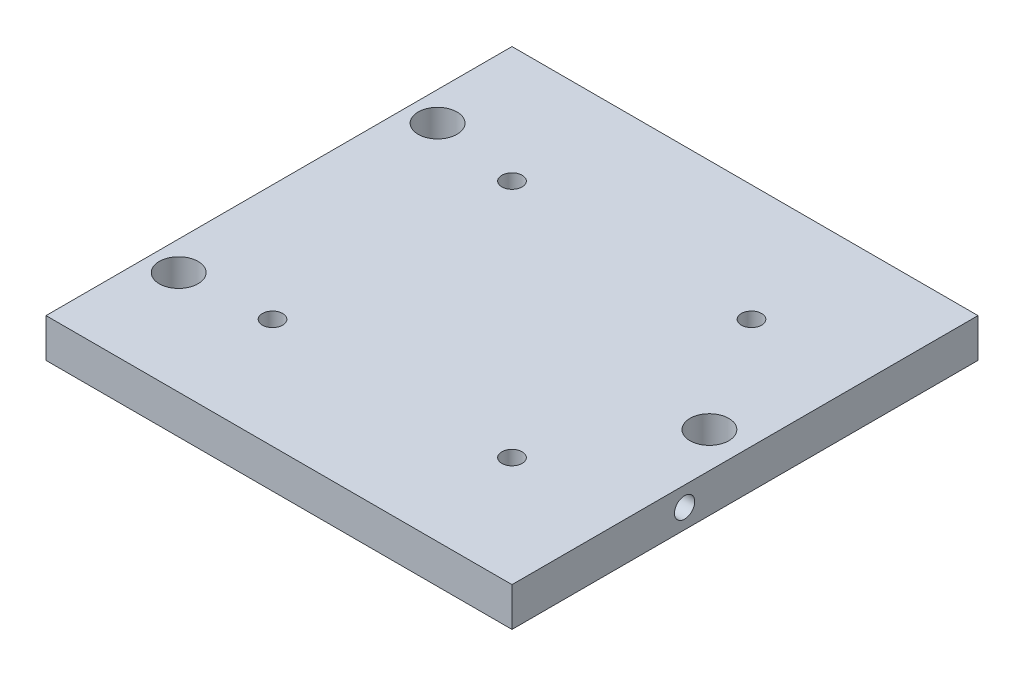
ISO-10303-21;
HEADER;
FILE_DESCRIPTION(('STEP AP214'),'2;1');
FILE_NAME('part.step','',(''),(''),'','','');
FILE_SCHEMA(('AUTOMOTIVE_DESIGN { 1 0 10303 214 1 1 1 1 }'));
ENDSEC;
DATA;
#1=APPLICATION_CONTEXT('core data for automotive mechanical design processes');
#2=APPLICATION_PROTOCOL_DEFINITION('international standard','automotive_design',2000,#1);
#3=PRODUCT_CONTEXT('',#1,'mechanical');
#4=PRODUCT('Part','Part','',(#3));
#5=PRODUCT_RELATED_PRODUCT_CATEGORY('part','',(#4));
#6=PRODUCT_DEFINITION_FORMATION('','',#4);
#7=PRODUCT_DEFINITION_CONTEXT('part definition',#1,'design');
#8=PRODUCT_DEFINITION('design','',#6,#7);
#9=PRODUCT_DEFINITION_SHAPE('','',#8);
#10=(LENGTH_UNIT() NAMED_UNIT(*) SI_UNIT(.MILLI.,.METRE.));
#11=(NAMED_UNIT(*) PLANE_ANGLE_UNIT() SI_UNIT($,.RADIAN.));
#12=(NAMED_UNIT(*) SI_UNIT($,.STERADIAN.) SOLID_ANGLE_UNIT());
#13=UNCERTAINTY_MEASURE_WITH_UNIT(LENGTH_MEASURE(1.E-05),#10,'distance_accuracy_value','');
#14=(GEOMETRIC_REPRESENTATION_CONTEXT(3) GLOBAL_UNCERTAINTY_ASSIGNED_CONTEXT((#13)) GLOBAL_UNIT_ASSIGNED_CONTEXT((#10,
#11,#12)) REPRESENTATION_CONTEXT('',''));
#15=CARTESIAN_POINT('',(0.,0.,0.));
#16=DIRECTION('',(0.,0.,1.));
#17=DIRECTION('',(1.,0.,0.));
#18=AXIS2_PLACEMENT_3D('',#15,#16,#17);
#19=CARTESIAN_POINT('',(-32.940625,9.525,-33.1390625));
#20=DIRECTION('',(1.,0.,0.));
#21=DIRECTION('',(0.,0.,-1.));
#22=AXIS2_PLACEMENT_3D('',#19,#20,#21);
#23=PLANE('',#22);
#24=CARTESIAN_POINT('',(-32.940625,3.175,24.0109375));
#25=DIRECTION('',(-1.,0.,0.));
#26=DIRECTION('',(0.,0.,1.));
#27=AXIS2_PLACEMENT_3D('',#24,#25,#26);
#28=CIRCLE('',#27,0.793749999999999);
#29=CARTESIAN_POINT('',(-32.940625,3.175,24.8046875));
#30=VERTEX_POINT('',#29);
#31=EDGE_CURVE('E151',#30,#30,#28,.T.);
#32=ORIENTED_EDGE('',*,*,#31,.F.);
#33=EDGE_LOOP('',(#32));
#34=FACE_BOUND('',#33,.T.);
#35=DIRECTION('',(0.,0.,1.));
#36=VECTOR('',#35,1.);
#37=CARTESIAN_POINT('',(-32.940625,0.,-33.1390625));
#38=LINE('',#37,#36);
#39=CARTESIAN_POINT('',(-32.940625,0.,-33.1390625));
#40=VERTEX_POINT('',#39);
#41=CARTESIAN_POINT('',(-32.940625,0.,81.1609375));
#42=VERTEX_POINT('',#41);
#43=EDGE_CURVE('E157',#40,#42,#38,.T.);
#44=ORIENTED_EDGE('',*,*,#43,.T.);
#45=DIRECTION('',(0.,-1.,0.));
#46=VECTOR('',#45,1.);
#47=CARTESIAN_POINT('',(-32.940625,9.525,81.1609375));
#48=LINE('',#47,#46);
#49=CARTESIAN_POINT('',(-32.940625,9.525,81.1609375));
#50=VERTEX_POINT('',#49);
#51=EDGE_CURVE('E11',#50,#42,#48,.T.);
#52=ORIENTED_EDGE('',*,*,#51,.F.);
#53=DIRECTION('',(0.,0.,1.));
#54=VECTOR('',#53,1.);
#55=CARTESIAN_POINT('',(-32.940625,9.525,-33.1390625));
#56=LINE('',#55,#54);
#57=CARTESIAN_POINT('',(-32.940625,9.525,-33.1390625));
#58=VERTEX_POINT('',#57);
#59=EDGE_CURVE('E160',#58,#50,#56,.T.);
#60=ORIENTED_EDGE('',*,*,#59,.F.);
#61=DIRECTION('',(0.,-1.,0.));
#62=VECTOR('',#61,1.);
#63=CARTESIAN_POINT('',(-32.940625,9.525,-33.1390625));
#64=LINE('',#63,#62);
#65=EDGE_CURVE('E166',#58,#40,#64,.T.);
#66=ORIENTED_EDGE('',*,*,#65,.T.);
#67=EDGE_LOOP('',(#44,#52,#60,#66));
#68=FACE_BOUND('',#67,.T.);
#69=ADVANCED_FACE('F33',(#34,#68),#23,.F.);
#70=CARTESIAN_POINT('',(-32.940625,9.525,81.1609375));
#71=DIRECTION('',(0.,0.,-1.));
#72=DIRECTION('',(-1.,0.,0.));
#73=AXIS2_PLACEMENT_3D('',#70,#71,#72);
#74=PLANE('',#73);
#75=DIRECTION('',(1.,0.,0.));
#76=VECTOR('',#75,1.);
#77=CARTESIAN_POINT('',(-32.940625,0.,81.1609375));
#78=LINE('',#77,#76);
#79=CARTESIAN_POINT('',(81.359375,0.,81.1609375));
#80=VERTEX_POINT('',#79);
#81=EDGE_CURVE('E169',#42,#80,#78,.T.);
#82=ORIENTED_EDGE('',*,*,#81,.T.);
#83=DIRECTION('',(0.,-1.,0.));
#84=VECTOR('',#83,1.);
#85=CARTESIAN_POINT('',(81.359375,9.525,81.1609375));
#86=LINE('',#85,#84);
#87=CARTESIAN_POINT('',(81.359375,9.525,81.1609375));
#88=VERTEX_POINT('',#87);
#89=EDGE_CURVE('E41',#88,#80,#86,.T.);
#90=ORIENTED_EDGE('',*,*,#89,.F.);
#91=DIRECTION('',(1.,0.,0.));
#92=VECTOR('',#91,1.);
#93=CARTESIAN_POINT('',(-32.940625,9.525,81.1609375));
#94=LINE('',#93,#92);
#95=EDGE_CURVE('E80',#50,#88,#94,.T.);
#96=ORIENTED_EDGE('',*,*,#95,.F.);
#97=ORIENTED_EDGE('',*,*,#51,.T.);
#98=EDGE_LOOP('',(#82,#90,#96,#97));
#99=FACE_BOUND('',#98,.T.);
#100=ADVANCED_FACE('F193',(#99),#74,.F.);
#101=CARTESIAN_POINT('',(81.359375,9.525,-33.1390625));
#102=DIRECTION('',(-1.,0.,0.));
#103=DIRECTION('',(0.,0.,1.));
#104=AXIS2_PLACEMENT_3D('',#101,#102,#103);
#105=PLANE('',#104);
#106=CARTESIAN_POINT('',(81.359375,4.7625,38.827604082));
#107=DIRECTION('',(1.,0.,0.));
#108=DIRECTION('',(0.,0.,-1.));
#109=AXIS2_PLACEMENT_3D('',#106,#107,#108);
#110=CIRCLE('',#109,2.48919999999999);
#111=CARTESIAN_POINT('',(81.359375,4.7625,36.338404082));
#112=VERTEX_POINT('',#111);
#113=EDGE_CURVE('E107',#112,#112,#110,.T.);
#114=ORIENTED_EDGE('',*,*,#113,.F.);
#115=EDGE_LOOP('',(#114));
#116=FACE_BOUND('',#115,.T.);
#117=DIRECTION('',(0.,0.,-1.));
#118=VECTOR('',#117,1.);
#119=CARTESIAN_POINT('',(81.359375,0.,-33.1390625));
#120=LINE('',#119,#118);
#121=CARTESIAN_POINT('',(81.359375,0.,-33.1390625));
#122=VERTEX_POINT('',#121);
#123=EDGE_CURVE('E67',#80,#122,#120,.T.);
#124=ORIENTED_EDGE('',*,*,#123,.T.);
#125=DIRECTION('',(0.,-1.,0.));
#126=VECTOR('',#125,1.);
#127=CARTESIAN_POINT('',(81.359375,9.525,-33.1390625));
#128=LINE('',#127,#126);
#129=CARTESIAN_POINT('',(81.359375,9.525,-33.1390625));
#130=VERTEX_POINT('',#129);
#131=EDGE_CURVE('E174',#130,#122,#128,.T.);
#132=ORIENTED_EDGE('',*,*,#131,.F.);
#133=DIRECTION('',(0.,0.,-1.));
#134=VECTOR('',#133,1.);
#135=CARTESIAN_POINT('',(81.359375,9.525,-33.1390625));
#136=LINE('',#135,#134);
#137=EDGE_CURVE('E163',#88,#130,#136,.T.);
#138=ORIENTED_EDGE('',*,*,#137,.F.);
#139=ORIENTED_EDGE('',*,*,#89,.T.);
#140=EDGE_LOOP('',(#124,#132,#138,#139));
#141=FACE_BOUND('',#140,.T.);
#142=ADVANCED_FACE('F176',(#116,#141),#105,.F.);
#143=CARTESIAN_POINT('',(-32.940625,9.525,-33.1390625));
#144=DIRECTION('',(0.,0.,1.));
#145=DIRECTION('',(1.,0.,0.));
#146=AXIS2_PLACEMENT_3D('',#143,#144,#145);
#147=PLANE('',#146);
#148=DIRECTION('',(-1.,0.,0.));
#149=VECTOR('',#148,1.);
#150=CARTESIAN_POINT('',(-32.940625,0.,-33.1390625));
#151=LINE('',#150,#149);
#152=EDGE_CURVE('E73',#122,#40,#151,.T.);
#153=ORIENTED_EDGE('',*,*,#152,.T.);
#154=ORIENTED_EDGE('',*,*,#65,.F.);
#155=DIRECTION('',(-1.,0.,0.));
#156=VECTOR('',#155,1.);
#157=CARTESIAN_POINT('',(-32.940625,9.525,-33.1390625));
#158=LINE('',#157,#156);
#159=EDGE_CURVE('E49',#130,#58,#158,.T.);
#160=ORIENTED_EDGE('',*,*,#159,.F.);
#161=ORIENTED_EDGE('',*,*,#131,.T.);
#162=EDGE_LOOP('',(#153,#154,#160,#161));
#163=FACE_BOUND('',#162,.T.);
#164=ADVANCED_FACE('F183',(#163),#147,.F.);
#165=CARTESIAN_POINT('',(0.,9.525,0.));
#166=DIRECTION('',(0.,1.,0.));
#167=DIRECTION('',(0.,0.,1.));
#168=AXIS2_PLACEMENT_3D('',#165,#166,#167);
#169=PLANE('',#168);
#170=CARTESIAN_POINT('',(-4.36562499999998,9.525,-4.5640625));
#171=DIRECTION('',(0.,1.,0.));
#172=DIRECTION('',(0.,0.,1.));
#173=AXIS2_PLACEMENT_3D('',#170,#171,#172);
#174=CIRCLE('',#173,2.48919999999999);
#175=CARTESIAN_POINT('',(-4.36562499999998,9.525,-2.07486250000001));
#176=VERTEX_POINT('',#175);
#177=EDGE_CURVE('E106',#176,#176,#174,.T.);
#178=ORIENTED_EDGE('',*,*,#177,.F.);
#179=EDGE_LOOP('',(#178));
#180=FACE_BOUND('',#179,.T.);
#181=CARTESIAN_POINT('',(54.371875,9.525,-4.5640625));
#182=DIRECTION('',(0.,1.,0.));
#183=DIRECTION('',(0.,0.,1.));
#184=AXIS2_PLACEMENT_3D('',#181,#182,#183);
#185=CIRCLE('',#184,2.48919999999999);
#186=CARTESIAN_POINT('',(54.371875,9.525,-2.07486250000001));
#187=VERTEX_POINT('',#186);
#188=EDGE_CURVE('E117',#187,#187,#185,.T.);
#189=ORIENTED_EDGE('',*,*,#188,.F.);
#190=EDGE_LOOP('',(#189));
#191=FACE_BOUND('',#190,.T.);
#192=CARTESIAN_POINT('',(54.371875,9.525,54.1734375));
#193=DIRECTION('',(0.,1.,0.));
#194=DIRECTION('',(0.,0.,1.));
#195=AXIS2_PLACEMENT_3D('',#192,#193,#194);
#196=CIRCLE('',#195,2.48919999999999);
#197=CARTESIAN_POINT('',(54.371875,9.525,56.6626375));
#198=VERTEX_POINT('',#197);
#199=EDGE_CURVE('E123',#198,#198,#196,.T.);
#200=ORIENTED_EDGE('',*,*,#199,.F.);
#201=EDGE_LOOP('',(#200));
#202=FACE_BOUND('',#201,.T.);
#203=CARTESIAN_POINT('',(-4.36562499999999,9.525,54.1734375));
#204=DIRECTION('',(0.,1.,0.));
#205=DIRECTION('',(0.,0.,1.));
#206=AXIS2_PLACEMENT_3D('',#203,#204,#205);
#207=CIRCLE('',#206,2.48919999999999);
#208=CARTESIAN_POINT('',(-4.36562499999999,9.525,56.6626375));
#209=VERTEX_POINT('',#208);
#210=EDGE_CURVE('E129',#209,#209,#207,.T.);
#211=ORIENTED_EDGE('',*,*,#210,.F.);
#212=EDGE_LOOP('',(#211));
#213=FACE_BOUND('',#212,.T.);
#214=CARTESIAN_POINT('',(72.628125,9.525,24.0109375));
#215=DIRECTION('',(0.,1.,0.));
#216=DIRECTION('',(0.,0.,1.));
#217=AXIS2_PLACEMENT_3D('',#214,#215,#216);
#218=CIRCLE('',#217,4.7625);
#219=CARTESIAN_POINT('',(72.628125,9.525,28.7734375));
#220=VERTEX_POINT('',#219);
#221=EDGE_CURVE('E135',#220,#220,#218,.T.);
#222=ORIENTED_EDGE('',*,*,#221,.F.);
#223=EDGE_LOOP('',(#222));
#224=FACE_BOUND('',#223,.T.);
#225=CARTESIAN_POINT('',(-25.796875,9.525,-7.7390625));
#226=DIRECTION('',(0.,1.,0.));
#227=DIRECTION('',(0.,0.,1.));
#228=AXIS2_PLACEMENT_3D('',#225,#226,#227);
#229=CIRCLE('',#228,4.7625);
#230=CARTESIAN_POINT('',(-25.796875,9.525,-2.9765625));
#231=VERTEX_POINT('',#230);
#232=EDGE_CURVE('E139',#231,#231,#229,.T.);
#233=ORIENTED_EDGE('',*,*,#232,.F.);
#234=EDGE_LOOP('',(#233));
#235=FACE_BOUND('',#234,.T.);
#236=CARTESIAN_POINT('',(-25.796875,9.525,55.7609375));
#237=DIRECTION('',(0.,1.,0.));
#238=DIRECTION('',(0.,0.,1.));
#239=AXIS2_PLACEMENT_3D('',#236,#237,#238);
#240=CIRCLE('',#239,4.7625);
#241=CARTESIAN_POINT('',(-25.796875,9.525,60.5234375));
#242=VERTEX_POINT('',#241);
#243=EDGE_CURVE('E145',#242,#242,#240,.T.);
#244=ORIENTED_EDGE('',*,*,#243,.F.);
#245=EDGE_LOOP('',(#244));
#246=FACE_BOUND('',#245,.T.);
#247=ORIENTED_EDGE('',*,*,#59,.T.);
#248=ORIENTED_EDGE('',*,*,#95,.T.);
#249=ORIENTED_EDGE('',*,*,#137,.T.);
#250=ORIENTED_EDGE('',*,*,#159,.T.);
#251=EDGE_LOOP('',(#247,#248,#249,#250));
#252=FACE_BOUND('',#251,.T.);
#253=ADVANCED_FACE('F185',(#180,#191,#202,#213,#224,#235,#246,#252),#169,.T.);
#254=CARTESIAN_POINT('',(0.,0.,0.));
#255=DIRECTION('',(0.,1.,0.));
#256=DIRECTION('',(0.,0.,1.));
#257=AXIS2_PLACEMENT_3D('',#254,#255,#256);
#258=PLANE('',#257);
#259=CARTESIAN_POINT('',(72.628125,0.,24.0109375));
#260=DIRECTION('',(0.,1.,0.));
#261=DIRECTION('',(0.,0.,1.));
#262=AXIS2_PLACEMENT_3D('',#259,#260,#261);
#263=CIRCLE('',#262,4.7625);
#264=CARTESIAN_POINT('',(72.628125,0.,28.7734375));
#265=VERTEX_POINT('',#264);
#266=EDGE_CURVE('E136',#265,#265,#263,.T.);
#267=ORIENTED_EDGE('',*,*,#266,.T.);
#268=EDGE_LOOP('',(#267));
#269=FACE_BOUND('',#268,.T.);
#270=CARTESIAN_POINT('',(-25.796875,0.,-7.7390625));
#271=DIRECTION('',(0.,1.,0.));
#272=DIRECTION('',(0.,0.,1.));
#273=AXIS2_PLACEMENT_3D('',#270,#271,#272);
#274=CIRCLE('',#273,4.7625);
#275=CARTESIAN_POINT('',(-25.796875,0.,-2.9765625));
#276=VERTEX_POINT('',#275);
#277=EDGE_CURVE('E142',#276,#276,#274,.T.);
#278=ORIENTED_EDGE('',*,*,#277,.T.);
#279=EDGE_LOOP('',(#278));
#280=FACE_BOUND('',#279,.T.);
#281=CARTESIAN_POINT('',(-25.796875,0.,55.7609375));
#282=DIRECTION('',(0.,1.,0.));
#283=DIRECTION('',(0.,0.,1.));
#284=AXIS2_PLACEMENT_3D('',#281,#282,#283);
#285=CIRCLE('',#284,4.7625);
#286=CARTESIAN_POINT('',(-25.796875,0.,60.5234375));
#287=VERTEX_POINT('',#286);
#288=EDGE_CURVE('E148',#287,#287,#285,.T.);
#289=ORIENTED_EDGE('',*,*,#288,.T.);
#290=EDGE_LOOP('',(#289));
#291=FACE_BOUND('',#290,.T.);
#292=ORIENTED_EDGE('',*,*,#43,.F.);
#293=ORIENTED_EDGE('',*,*,#152,.F.);
#294=ORIENTED_EDGE('',*,*,#123,.F.);
#295=ORIENTED_EDGE('',*,*,#81,.F.);
#296=EDGE_LOOP('',(#292,#293,#294,#295));
#297=FACE_BOUND('',#296,.T.);
#298=ADVANCED_FACE('F179',(#269,#280,#291,#297),#258,.F.);
#299=CARTESIAN_POINT('',(27.384375,3.175,24.0109375));
#300=DIRECTION('',(-1.,0.,0.));
#301=DIRECTION('',(0.,0.,1.));
#302=AXIS2_PLACEMENT_3D('',#299,#300,#301);
#303=CYLINDRICAL_SURFACE('',#302,0.793749999999999);
#304=CARTESIAN_POINT('',(27.384375,3.175,24.0109375));
#305=DIRECTION('',(-1.,0.,0.));
#306=DIRECTION('',(0.,0.,1.));
#307=AXIS2_PLACEMENT_3D('',#304,#305,#306);
#308=CIRCLE('',#307,0.793749999999999);
#309=CARTESIAN_POINT('',(27.384375,3.175,24.8046875));
#310=VERTEX_POINT('',#309);
#311=EDGE_CURVE('E154',#310,#310,#308,.T.);
#312=CARTESIAN_POINT('',(27.384375,3.175,24.8046875));
#313=CARTESIAN_POINT('',(26.7559895833334,3.175,24.8046875));
#314=CARTESIAN_POINT('',(26.1276041666667,3.175,24.8046875));
#315=CARTESIAN_POINT('',(24.8708333333334,3.175,24.8046875));
#316=CARTESIAN_POINT('',(24.2424479166667,3.175,24.8046875));
#317=CARTESIAN_POINT('',(22.9856770833334,3.175,24.8046875));
#318=CARTESIAN_POINT('',(22.3572916666667,3.175,24.8046875));
#319=CARTESIAN_POINT('',(21.1005208333334,3.175,24.8046875));
#320=CARTESIAN_POINT('',(20.4721354166667,3.175,24.8046875));
#321=CARTESIAN_POINT('',(19.2153645833334,3.175,24.8046875));
#322=CARTESIAN_POINT('',(18.5869791666667,3.175,24.8046875));
#323=CARTESIAN_POINT('',(17.3302083333334,3.175,24.8046875));
#324=CARTESIAN_POINT('',(16.7018229166667,3.175,24.8046875));
#325=CARTESIAN_POINT('',(15.4450520833334,3.175,24.8046875));
#326=CARTESIAN_POINT('',(14.8166666666667,3.175,24.8046875));
#327=CARTESIAN_POINT('',(13.5598958333334,3.175,24.8046875));
#328=CARTESIAN_POINT('',(12.9315104166667,3.175,24.8046875));
#329=CARTESIAN_POINT('',(11.6747395833334,3.175,24.8046875));
#330=CARTESIAN_POINT('',(11.0463541666667,3.175,24.8046875));
#331=CARTESIAN_POINT('',(9.78958333333336,3.175,24.8046875));
#332=CARTESIAN_POINT('',(9.16119791666669,3.175,24.8046875));
#333=CARTESIAN_POINT('',(7.90442708333335,3.175,24.8046875));
#334=CARTESIAN_POINT('',(7.27604166666669,3.175,24.8046875));
#335=CARTESIAN_POINT('',(6.01927083333336,3.175,24.8046875));
#336=CARTESIAN_POINT('',(5.39088541666669,3.175,24.8046875));
#337=CARTESIAN_POINT('',(4.13411458333336,3.175,24.8046875));
#338=CARTESIAN_POINT('',(3.50572916666669,3.175,24.8046875));
#339=CARTESIAN_POINT('',(2.24895833333336,3.175,24.8046875));
#340=CARTESIAN_POINT('',(1.62057291666669,3.175,24.8046875));
#341=CARTESIAN_POINT('',(0.363802083333355,3.175,24.8046875));
#342=CARTESIAN_POINT('',(-0.264583333333312,3.175,24.8046875));
#343=CARTESIAN_POINT('',(-1.52135416666665,3.175,24.8046875));
#344=CARTESIAN_POINT('',(-2.14973958333331,3.175,24.8046875));
#345=CARTESIAN_POINT('',(-3.40651041666665,3.175,24.8046875));
#346=CARTESIAN_POINT('',(-4.03489583333331,3.175,24.8046875));
#347=CARTESIAN_POINT('',(-5.29166666666664,3.175,24.8046875));
#348=CARTESIAN_POINT('',(-5.92005208333331,3.175,24.8046875));
#349=CARTESIAN_POINT('',(-7.17682291666664,3.175,24.8046875));
#350=CARTESIAN_POINT('',(-7.80520833333331,3.175,24.8046875));
#351=CARTESIAN_POINT('',(-9.06197916666665,3.175,24.8046875));
#352=CARTESIAN_POINT('',(-9.69036458333331,3.175,24.8046875));
#353=CARTESIAN_POINT('',(-10.9471354166666,3.175,24.8046875));
#354=CARTESIAN_POINT('',(-11.5755208333333,3.175,24.8046875));
#355=CARTESIAN_POINT('',(-12.8322916666666,3.175,24.8046875));
#356=CARTESIAN_POINT('',(-13.4606770833333,3.175,24.8046875));
#357=CARTESIAN_POINT('',(-14.7174479166666,3.175,24.8046875));
#358=CARTESIAN_POINT('',(-15.3458333333333,3.175,24.8046875));
#359=CARTESIAN_POINT('',(-16.6026041666666,3.175,24.8046875));
#360=CARTESIAN_POINT('',(-17.2309895833333,3.175,24.8046875));
#361=CARTESIAN_POINT('',(-18.4877604166666,3.175,24.8046875));
#362=CARTESIAN_POINT('',(-19.1161458333333,3.175,24.8046875));
#363=CARTESIAN_POINT('',(-20.3729166666666,3.175,24.8046875));
#364=CARTESIAN_POINT('',(-21.0013020833333,3.175,24.8046875));
#365=CARTESIAN_POINT('',(-22.2580729166666,3.175,24.8046875));
#366=CARTESIAN_POINT('',(-22.8864583333333,3.175,24.8046875));
#367=CARTESIAN_POINT('',(-24.1432291666666,3.175,24.8046875));
#368=CARTESIAN_POINT('',(-24.7716145833333,3.175,24.8046875));
#369=CARTESIAN_POINT('',(-26.0283854166666,3.175,24.8046875));
#370=CARTESIAN_POINT('',(-26.6567708333333,3.175,24.8046875));
#371=CARTESIAN_POINT('',(-27.9135416666666,3.175,24.8046875));
#372=CARTESIAN_POINT('',(-28.5419270833333,3.175,24.8046875));
#373=CARTESIAN_POINT('',(-29.7986979166666,3.175,24.8046875));
#374=CARTESIAN_POINT('',(-30.4270833333333,3.175,24.8046875));
#375=CARTESIAN_POINT('',(-31.6838541666666,3.175,24.8046875));
#376=CARTESIAN_POINT('',(-32.3122395833333,3.175,24.8046875));
#377=CARTESIAN_POINT('',(-32.940625,3.175,24.8046875));
#378=B_SPLINE_CURVE_WITH_KNOTS('',3,(#312,#313,#314,#315,#316,#317,#318,#319,#320,#321,#322,
#323,#324,#325,#326,#327,#328,#329,#330,#331,#332,#333,#334,#335,#336,#337,#338,#339,#340,#341,
#342,#343,#344,#345,#346,#347,#348,#349,#350,#351,#352,#353,#354,#355,#356,#357,#358,#359,#360,
#361,#362,#363,#364,#365,#366,#367,#368,#369,#370,#371,#372,#373,#374,#375,#376,#377),
.UNSPECIFIED.,.F.,.F.,(4,2,2,2,2,2,2,2,2,2,2,2,2,2,2,2,2,2,2,2,2,2,2,2,2,2,2,2,2,2,2,2,4),(0.,
1.88515625,3.7703125,5.65546875,7.540625,9.42578125,11.3109375,13.19609375,15.08125,16.96640625,
18.8515625,20.73671875,22.621875,24.50703125,26.3921875,28.27734375,30.1625,32.04765625,
33.9328125,35.81796875,37.703125,39.58828125,41.4734375,43.35859375,45.24375,47.12890625,
49.0140625,50.89921875,52.784375,54.66953125,56.5546875,58.43984375,60.325),.UNSPECIFIED.);
#379=EDGE_CURVE('BSEAM204',#310,#30,#378,.T.);
#380=ORIENTED_EDGE('',*,*,#311,.F.);
#381=ORIENTED_EDGE('',*,*,#31,.T.);
#382=ORIENTED_EDGE('',*,*,#379,.T.);
#383=ORIENTED_EDGE('',*,*,#379,.F.);
#384=EDGE_LOOP('',(#380,#382,#381,#383));
#385=FACE_BOUND('',#384,.T.);
#386=ADVANCED_FACE('F204',(#385),#303,.F.);
#387=CARTESIAN_POINT('',(27.384375,3.175,24.0109375));
#388=DIRECTION('',(-1.,0.,0.));
#389=DIRECTION('',(0.,0.,1.));
#390=AXIS2_PLACEMENT_3D('',#387,#388,#389);
#391=PLANE('',#390);
#392=ORIENTED_EDGE('',*,*,#311,.T.);
#393=EDGE_LOOP('',(#392));
#394=FACE_BOUND('',#393,.T.);
#395=ADVANCED_FACE('F206',(#394),#391,.T.);
#396=CARTESIAN_POINT('',(-25.796875,0.,55.7609375));
#397=DIRECTION('',(0.,1.,0.));
#398=DIRECTION('',(0.,0.,1.));
#399=AXIS2_PLACEMENT_3D('',#396,#397,#398);
#400=CYLINDRICAL_SURFACE('',#399,4.7625);
#401=CARTESIAN_POINT('',(-25.796875,0.,60.5234375));
#402=CARTESIAN_POINT('',(-25.796875,0.0992187499999999,60.5234375));
#403=CARTESIAN_POINT('',(-25.796875,0.1984375,60.5234375));
#404=CARTESIAN_POINT('',(-25.796875,0.396875,60.5234375));
#405=CARTESIAN_POINT('',(-25.796875,0.49609375,60.5234375));
#406=CARTESIAN_POINT('',(-25.796875,0.69453125,60.5234375));
#407=CARTESIAN_POINT('',(-25.796875,0.79375,60.5234375));
#408=CARTESIAN_POINT('',(-25.796875,0.9921875,60.5234375));
#409=CARTESIAN_POINT('',(-25.796875,1.09140625,60.5234375));
#410=CARTESIAN_POINT('',(-25.796875,1.28984375,60.5234375));
#411=CARTESIAN_POINT('',(-25.796875,1.3890625,60.5234375));
#412=CARTESIAN_POINT('',(-25.796875,1.5875,60.5234375));
#413=CARTESIAN_POINT('',(-25.796875,1.68671875,60.5234375));
#414=CARTESIAN_POINT('',(-25.796875,1.88515625,60.5234375));
#415=CARTESIAN_POINT('',(-25.796875,1.984375,60.5234375));
#416=CARTESIAN_POINT('',(-25.796875,2.1828125,60.5234375));
#417=CARTESIAN_POINT('',(-25.796875,2.28203125,60.5234375));
#418=CARTESIAN_POINT('',(-25.796875,2.48046875,60.5234375));
#419=CARTESIAN_POINT('',(-25.796875,2.5796875,60.5234375));
#420=CARTESIAN_POINT('',(-25.796875,2.778125,60.5234375));
#421=CARTESIAN_POINT('',(-25.796875,2.87734375,60.5234375));
#422=CARTESIAN_POINT('',(-25.796875,3.07578125,60.5234375));
#423=CARTESIAN_POINT('',(-25.796875,3.175,60.5234375));
#424=CARTESIAN_POINT('',(-25.796875,3.3734375,60.5234375));
#425=CARTESIAN_POINT('',(-25.796875,3.47265625,60.5234375));
#426=CARTESIAN_POINT('',(-25.796875,3.67109375,60.5234375));
#427=CARTESIAN_POINT('',(-25.796875,3.7703125,60.5234375));
#428=CARTESIAN_POINT('',(-25.796875,3.96875,60.5234375));
#429=CARTESIAN_POINT('',(-25.796875,4.06796875,60.5234375));
#430=CARTESIAN_POINT('',(-25.796875,4.26640625,60.5234375));
#431=CARTESIAN_POINT('',(-25.796875,4.365625,60.5234375));
#432=CARTESIAN_POINT('',(-25.796875,4.5640625,60.5234375));
#433=CARTESIAN_POINT('',(-25.796875,4.66328125,60.5234375));
#434=CARTESIAN_POINT('',(-25.796875,4.86171875,60.5234375));
#435=CARTESIAN_POINT('',(-25.796875,4.9609375,60.5234375));
#436=CARTESIAN_POINT('',(-25.796875,5.159375,60.5234375));
#437=CARTESIAN_POINT('',(-25.796875,5.25859375,60.5234375));
#438=CARTESIAN_POINT('',(-25.796875,5.45703125,60.5234375));
#439=CARTESIAN_POINT('',(-25.796875,5.55625,60.5234375));
#440=CARTESIAN_POINT('',(-25.796875,5.7546875,60.5234375));
#441=CARTESIAN_POINT('',(-25.796875,5.85390625,60.5234375));
#442=CARTESIAN_POINT('',(-25.796875,6.05234375,60.5234375));
#443=CARTESIAN_POINT('',(-25.796875,6.1515625,60.5234375));
#444=CARTESIAN_POINT('',(-25.796875,6.35,60.5234375));
#445=CARTESIAN_POINT('',(-25.796875,6.44921875,60.5234375));
#446=CARTESIAN_POINT('',(-25.796875,6.64765625,60.5234375));
#447=CARTESIAN_POINT('',(-25.796875,6.746875,60.5234375));
#448=CARTESIAN_POINT('',(-25.796875,6.9453125,60.5234375));
#449=CARTESIAN_POINT('',(-25.796875,7.04453125,60.5234375));
#450=CARTESIAN_POINT('',(-25.796875,7.24296875,60.5234375));
#451=CARTESIAN_POINT('',(-25.796875,7.3421875,60.5234375));
#452=CARTESIAN_POINT('',(-25.796875,7.540625,60.5234375));
#453=CARTESIAN_POINT('',(-25.796875,7.63984375,60.5234375));
#454=CARTESIAN_POINT('',(-25.796875,7.83828125,60.5234375));
#455=CARTESIAN_POINT('',(-25.796875,7.9375,60.5234375));
#456=CARTESIAN_POINT('',(-25.796875,8.1359375,60.5234375));
#457=CARTESIAN_POINT('',(-25.796875,8.23515625,60.5234375));
#458=CARTESIAN_POINT('',(-25.796875,8.43359375,60.5234375));
#459=CARTESIAN_POINT('',(-25.796875,8.5328125,60.5234375));
#460=CARTESIAN_POINT('',(-25.796875,8.73125,60.5234375));
#461=CARTESIAN_POINT('',(-25.796875,8.83046875,60.5234375));
#462=CARTESIAN_POINT('',(-25.796875,9.02890625,60.5234375));
#463=CARTESIAN_POINT('',(-25.796875,9.128125,60.5234375));
#464=CARTESIAN_POINT('',(-25.796875,9.3265625,60.5234375));
#465=CARTESIAN_POINT('',(-25.796875,9.42578125,60.5234375));
#466=CARTESIAN_POINT('',(-25.796875,9.525,60.5234375));
#467=B_SPLINE_CURVE_WITH_KNOTS('',3,(#401,#402,#403,#404,#405,#406,#407,#408,#409,#410,#411,
#412,#413,#414,#415,#416,#417,#418,#419,#420,#421,#422,#423,#424,#425,#426,#427,#428,#429,#430,
#431,#432,#433,#434,#435,#436,#437,#438,#439,#440,#441,#442,#443,#444,#445,#446,#447,#448,#449,
#450,#451,#452,#453,#454,#455,#456,#457,#458,#459,#460,#461,#462,#463,#464,#465,#466),
.UNSPECIFIED.,.F.,.F.,(4,2,2,2,2,2,2,2,2,2,2,2,2,2,2,2,2,2,2,2,2,2,2,2,2,2,2,2,2,2,2,2,4),(0.,
0.29765625,0.5953125,0.89296875,1.190625,1.48828125,1.7859375,2.08359375,2.38125,2.67890625,
2.9765625,3.27421875,3.571875,3.86953125,4.1671875,4.46484375,4.7625,5.06015625,5.3578125,
5.65546875,5.953125,6.25078125,6.5484375,6.84609375,7.14375,7.44140625,7.7390625,8.03671875,
8.334375,8.63203125,8.9296875,9.22734375,9.525),.UNSPECIFIED.);
#468=EDGE_CURVE('BSEAM213',#287,#242,#467,.T.);
#469=ORIENTED_EDGE('',*,*,#288,.F.);
#470=ORIENTED_EDGE('',*,*,#243,.T.);
#471=ORIENTED_EDGE('',*,*,#468,.T.);
#472=ORIENTED_EDGE('',*,*,#468,.F.);
#473=EDGE_LOOP('',(#469,#471,#470,#472));
#474=FACE_BOUND('',#473,.T.);
#475=ADVANCED_FACE('F213',(#474),#400,.F.);
#476=CARTESIAN_POINT('',(-25.796875,0.,-7.7390625));
#477=DIRECTION('',(0.,1.,0.));
#478=DIRECTION('',(0.,0.,1.));
#479=AXIS2_PLACEMENT_3D('',#476,#477,#478);
#480=CYLINDRICAL_SURFACE('',#479,4.7625);
#481=CARTESIAN_POINT('',(-25.796875,0.,-2.9765625));
#482=CARTESIAN_POINT('',(-25.796875,0.0992187499999999,-2.9765625));
#483=CARTESIAN_POINT('',(-25.796875,0.1984375,-2.9765625));
#484=CARTESIAN_POINT('',(-25.796875,0.396875,-2.9765625));
#485=CARTESIAN_POINT('',(-25.796875,0.49609375,-2.9765625));
#486=CARTESIAN_POINT('',(-25.796875,0.69453125,-2.9765625));
#487=CARTESIAN_POINT('',(-25.796875,0.79375,-2.9765625));
#488=CARTESIAN_POINT('',(-25.796875,0.9921875,-2.9765625));
#489=CARTESIAN_POINT('',(-25.796875,1.09140625,-2.9765625));
#490=CARTESIAN_POINT('',(-25.796875,1.28984375,-2.9765625));
#491=CARTESIAN_POINT('',(-25.796875,1.3890625,-2.9765625));
#492=CARTESIAN_POINT('',(-25.796875,1.5875,-2.9765625));
#493=CARTESIAN_POINT('',(-25.796875,1.68671875,-2.9765625));
#494=CARTESIAN_POINT('',(-25.796875,1.88515625,-2.9765625));
#495=CARTESIAN_POINT('',(-25.796875,1.984375,-2.9765625));
#496=CARTESIAN_POINT('',(-25.796875,2.1828125,-2.9765625));
#497=CARTESIAN_POINT('',(-25.796875,2.28203125,-2.9765625));
#498=CARTESIAN_POINT('',(-25.796875,2.48046875,-2.9765625));
#499=CARTESIAN_POINT('',(-25.796875,2.5796875,-2.9765625));
#500=CARTESIAN_POINT('',(-25.796875,2.778125,-2.9765625));
#501=CARTESIAN_POINT('',(-25.796875,2.87734375,-2.9765625));
#502=CARTESIAN_POINT('',(-25.796875,3.07578125,-2.9765625));
#503=CARTESIAN_POINT('',(-25.796875,3.175,-2.9765625));
#504=CARTESIAN_POINT('',(-25.796875,3.3734375,-2.9765625));
#505=CARTESIAN_POINT('',(-25.796875,3.47265625,-2.9765625));
#506=CARTESIAN_POINT('',(-25.796875,3.67109375,-2.9765625));
#507=CARTESIAN_POINT('',(-25.796875,3.7703125,-2.9765625));
#508=CARTESIAN_POINT('',(-25.796875,3.96875,-2.9765625));
#509=CARTESIAN_POINT('',(-25.796875,4.06796875,-2.9765625));
#510=CARTESIAN_POINT('',(-25.796875,4.26640625,-2.9765625));
#511=CARTESIAN_POINT('',(-25.796875,4.365625,-2.9765625));
#512=CARTESIAN_POINT('',(-25.796875,4.5640625,-2.9765625));
#513=CARTESIAN_POINT('',(-25.796875,4.66328125,-2.9765625));
#514=CARTESIAN_POINT('',(-25.796875,4.86171875,-2.9765625));
#515=CARTESIAN_POINT('',(-25.796875,4.9609375,-2.9765625));
#516=CARTESIAN_POINT('',(-25.796875,5.159375,-2.9765625));
#517=CARTESIAN_POINT('',(-25.796875,5.25859375,-2.9765625));
#518=CARTESIAN_POINT('',(-25.796875,5.45703125,-2.9765625));
#519=CARTESIAN_POINT('',(-25.796875,5.55625,-2.9765625));
#520=CARTESIAN_POINT('',(-25.796875,5.7546875,-2.9765625));
#521=CARTESIAN_POINT('',(-25.796875,5.85390625,-2.9765625));
#522=CARTESIAN_POINT('',(-25.796875,6.05234375,-2.9765625));
#523=CARTESIAN_POINT('',(-25.796875,6.1515625,-2.9765625));
#524=CARTESIAN_POINT('',(-25.796875,6.35,-2.9765625));
#525=CARTESIAN_POINT('',(-25.796875,6.44921875,-2.9765625));
#526=CARTESIAN_POINT('',(-25.796875,6.64765625,-2.9765625));
#527=CARTESIAN_POINT('',(-25.796875,6.746875,-2.9765625));
#528=CARTESIAN_POINT('',(-25.796875,6.9453125,-2.9765625));
#529=CARTESIAN_POINT('',(-25.796875,7.04453125,-2.9765625));
#530=CARTESIAN_POINT('',(-25.796875,7.24296875,-2.9765625));
#531=CARTESIAN_POINT('',(-25.796875,7.3421875,-2.9765625));
#532=CARTESIAN_POINT('',(-25.796875,7.540625,-2.9765625));
#533=CARTESIAN_POINT('',(-25.796875,7.63984375,-2.9765625));
#534=CARTESIAN_POINT('',(-25.796875,7.83828125,-2.9765625));
#535=CARTESIAN_POINT('',(-25.796875,7.9375,-2.9765625));
#536=CARTESIAN_POINT('',(-25.796875,8.1359375,-2.9765625));
#537=CARTESIAN_POINT('',(-25.796875,8.23515625,-2.9765625));
#538=CARTESIAN_POINT('',(-25.796875,8.43359375,-2.9765625));
#539=CARTESIAN_POINT('',(-25.796875,8.5328125,-2.9765625));
#540=CARTESIAN_POINT('',(-25.796875,8.73125,-2.9765625));
#541=CARTESIAN_POINT('',(-25.796875,8.83046875,-2.9765625));
#542=CARTESIAN_POINT('',(-25.796875,9.02890625,-2.9765625));
#543=CARTESIAN_POINT('',(-25.796875,9.128125,-2.9765625));
#544=CARTESIAN_POINT('',(-25.796875,9.3265625,-2.9765625));
#545=CARTESIAN_POINT('',(-25.796875,9.42578125,-2.9765625));
#546=CARTESIAN_POINT('',(-25.796875,9.525,-2.9765625));
#547=B_SPLINE_CURVE_WITH_KNOTS('',3,(#481,#482,#483,#484,#485,#486,#487,#488,#489,#490,#491,
#492,#493,#494,#495,#496,#497,#498,#499,#500,#501,#502,#503,#504,#505,#506,#507,#508,#509,#510,
#511,#512,#513,#514,#515,#516,#517,#518,#519,#520,#521,#522,#523,#524,#525,#526,#527,#528,#529,
#530,#531,#532,#533,#534,#535,#536,#537,#538,#539,#540,#541,#542,#543,#544,#545,#546),
.UNSPECIFIED.,.F.,.F.,(4,2,2,2,2,2,2,2,2,2,2,2,2,2,2,2,2,2,2,2,2,2,2,2,2,2,2,2,2,2,2,2,4),(0.,
0.29765625,0.5953125,0.89296875,1.190625,1.48828125,1.7859375,2.08359375,2.38125,2.67890625,
2.9765625,3.27421875,3.571875,3.86953125,4.1671875,4.46484375,4.7625,5.06015625,5.3578125,
5.65546875,5.953125,6.25078125,6.5484375,6.84609375,7.14375,7.44140625,7.7390625,8.03671875,
8.334375,8.63203125,8.9296875,9.22734375,9.525),.UNSPECIFIED.);
#548=EDGE_CURVE('BSEAM221',#276,#231,#547,.T.);
#549=ORIENTED_EDGE('',*,*,#277,.F.);
#550=ORIENTED_EDGE('',*,*,#232,.T.);
#551=ORIENTED_EDGE('',*,*,#548,.T.);
#552=ORIENTED_EDGE('',*,*,#548,.F.);
#553=EDGE_LOOP('',(#549,#551,#550,#552));
#554=FACE_BOUND('',#553,.T.);
#555=ADVANCED_FACE('F221',(#554),#480,.F.);
#556=CARTESIAN_POINT('',(72.628125,0.,24.0109375));
#557=DIRECTION('',(0.,1.,0.));
#558=DIRECTION('',(0.,0.,1.));
#559=AXIS2_PLACEMENT_3D('',#556,#557,#558);
#560=CYLINDRICAL_SURFACE('',#559,4.7625);
#561=CARTESIAN_POINT('',(72.628125,0.,28.7734375));
#562=CARTESIAN_POINT('',(72.628125,0.0992187499999999,28.7734375));
#563=CARTESIAN_POINT('',(72.628125,0.1984375,28.7734375));
#564=CARTESIAN_POINT('',(72.628125,0.396875,28.7734375));
#565=CARTESIAN_POINT('',(72.628125,0.49609375,28.7734375));
#566=CARTESIAN_POINT('',(72.628125,0.69453125,28.7734375));
#567=CARTESIAN_POINT('',(72.628125,0.79375,28.7734375));
#568=CARTESIAN_POINT('',(72.628125,0.9921875,28.7734375));
#569=CARTESIAN_POINT('',(72.628125,1.09140625,28.7734375));
#570=CARTESIAN_POINT('',(72.628125,1.28984375,28.7734375));
#571=CARTESIAN_POINT('',(72.628125,1.3890625,28.7734375));
#572=CARTESIAN_POINT('',(72.628125,1.5875,28.7734375));
#573=CARTESIAN_POINT('',(72.628125,1.68671875,28.7734375));
#574=CARTESIAN_POINT('',(72.628125,1.88515625,28.7734375));
#575=CARTESIAN_POINT('',(72.628125,1.984375,28.7734375));
#576=CARTESIAN_POINT('',(72.628125,2.1828125,28.7734375));
#577=CARTESIAN_POINT('',(72.628125,2.28203125,28.7734375));
#578=CARTESIAN_POINT('',(72.628125,2.48046875,28.7734375));
#579=CARTESIAN_POINT('',(72.628125,2.5796875,28.7734375));
#580=CARTESIAN_POINT('',(72.628125,2.778125,28.7734375));
#581=CARTESIAN_POINT('',(72.628125,2.87734375,28.7734375));
#582=CARTESIAN_POINT('',(72.628125,3.07578125,28.7734375));
#583=CARTESIAN_POINT('',(72.628125,3.175,28.7734375));
#584=CARTESIAN_POINT('',(72.628125,3.3734375,28.7734375));
#585=CARTESIAN_POINT('',(72.628125,3.47265625,28.7734375));
#586=CARTESIAN_POINT('',(72.628125,3.67109375,28.7734375));
#587=CARTESIAN_POINT('',(72.628125,3.7703125,28.7734375));
#588=CARTESIAN_POINT('',(72.628125,3.96875,28.7734375));
#589=CARTESIAN_POINT('',(72.628125,4.06796875,28.7734375));
#590=CARTESIAN_POINT('',(72.628125,4.26640625,28.7734375));
#591=CARTESIAN_POINT('',(72.628125,4.365625,28.7734375));
#592=CARTESIAN_POINT('',(72.628125,4.5640625,28.7734375));
#593=CARTESIAN_POINT('',(72.628125,4.66328125,28.7734375));
#594=CARTESIAN_POINT('',(72.628125,4.86171875,28.7734375));
#595=CARTESIAN_POINT('',(72.628125,4.9609375,28.7734375));
#596=CARTESIAN_POINT('',(72.628125,5.159375,28.7734375));
#597=CARTESIAN_POINT('',(72.628125,5.25859375,28.7734375));
#598=CARTESIAN_POINT('',(72.628125,5.45703125,28.7734375));
#599=CARTESIAN_POINT('',(72.628125,5.55625,28.7734375));
#600=CARTESIAN_POINT('',(72.628125,5.7546875,28.7734375));
#601=CARTESIAN_POINT('',(72.628125,5.85390625,28.7734375));
#602=CARTESIAN_POINT('',(72.628125,6.05234375,28.7734375));
#603=CARTESIAN_POINT('',(72.628125,6.1515625,28.7734375));
#604=CARTESIAN_POINT('',(72.628125,6.35,28.7734375));
#605=CARTESIAN_POINT('',(72.628125,6.44921875,28.7734375));
#606=CARTESIAN_POINT('',(72.628125,6.64765625,28.7734375));
#607=CARTESIAN_POINT('',(72.628125,6.746875,28.7734375));
#608=CARTESIAN_POINT('',(72.628125,6.9453125,28.7734375));
#609=CARTESIAN_POINT('',(72.628125,7.04453125,28.7734375));
#610=CARTESIAN_POINT('',(72.628125,7.24296875,28.7734375));
#611=CARTESIAN_POINT('',(72.628125,7.3421875,28.7734375));
#612=CARTESIAN_POINT('',(72.628125,7.540625,28.7734375));
#613=CARTESIAN_POINT('',(72.628125,7.63984375,28.7734375));
#614=CARTESIAN_POINT('',(72.628125,7.83828125,28.7734375));
#615=CARTESIAN_POINT('',(72.628125,7.9375,28.7734375));
#616=CARTESIAN_POINT('',(72.628125,8.1359375,28.7734375));
#617=CARTESIAN_POINT('',(72.628125,8.23515625,28.7734375));
#618=CARTESIAN_POINT('',(72.628125,8.43359375,28.7734375));
#619=CARTESIAN_POINT('',(72.628125,8.5328125,28.7734375));
#620=CARTESIAN_POINT('',(72.628125,8.73125,28.7734375));
#621=CARTESIAN_POINT('',(72.628125,8.83046875,28.7734375));
#622=CARTESIAN_POINT('',(72.628125,9.02890625,28.7734375));
#623=CARTESIAN_POINT('',(72.628125,9.128125,28.7734375));
#624=CARTESIAN_POINT('',(72.628125,9.3265625,28.7734375));
#625=CARTESIAN_POINT('',(72.628125,9.42578125,28.7734375));
#626=CARTESIAN_POINT('',(72.628125,9.525,28.7734375));
#627=B_SPLINE_CURVE_WITH_KNOTS('',3,(#561,#562,#563,#564,#565,#566,#567,#568,#569,#570,#571,
#572,#573,#574,#575,#576,#577,#578,#579,#580,#581,#582,#583,#584,#585,#586,#587,#588,#589,#590,
#591,#592,#593,#594,#595,#596,#597,#598,#599,#600,#601,#602,#603,#604,#605,#606,#607,#608,#609,
#610,#611,#612,#613,#614,#615,#616,#617,#618,#619,#620,#621,#622,#623,#624,#625,#626),
.UNSPECIFIED.,.F.,.F.,(4,2,2,2,2,2,2,2,2,2,2,2,2,2,2,2,2,2,2,2,2,2,2,2,2,2,2,2,2,2,2,2,4),(0.,
0.29765625,0.5953125,0.89296875,1.190625,1.48828125,1.7859375,2.08359375,2.38125,2.67890625,
2.9765625,3.27421875,3.571875,3.86953125,4.1671875,4.46484375,4.7625,5.06015625,5.3578125,
5.65546875,5.953125,6.25078125,6.5484375,6.84609375,7.14375,7.44140625,7.7390625,8.03671875,
8.334375,8.63203125,8.9296875,9.22734375,9.525),.UNSPECIFIED.);
#628=EDGE_CURVE('BSEAM225',#265,#220,#627,.T.);
#629=ORIENTED_EDGE('',*,*,#266,.F.);
#630=ORIENTED_EDGE('',*,*,#221,.T.);
#631=ORIENTED_EDGE('',*,*,#628,.T.);
#632=ORIENTED_EDGE('',*,*,#628,.F.);
#633=EDGE_LOOP('',(#629,#631,#630,#632));
#634=FACE_BOUND('',#633,.T.);
#635=ADVANCED_FACE('F225',(#634),#560,.F.);
#636=CARTESIAN_POINT('',(-4.36562499999999,3.175,54.1734375));
#637=DIRECTION('',(0.,1.,0.));
#638=DIRECTION('',(0.,0.,1.));
#639=AXIS2_PLACEMENT_3D('',#636,#637,#638);
#640=CONICAL_SURFACE('',#639,2.4892,1.02974425867665);
#641=CARTESIAN_POINT('',(-4.36562499999999,1.6793377471166,54.1734375));
#642=VERTEX_POINT('',#641);
#643=VERTEX_LOOP('',#642);
#644=FACE_BOUND('',#643,.T.);
#645=CARTESIAN_POINT('',(-4.36562499999999,3.175,54.1734375));
#646=DIRECTION('',(0.,1.,0.));
#647=DIRECTION('',(0.,0.,1.));
#648=AXIS2_PLACEMENT_3D('',#645,#646,#647);
#649=CIRCLE('',#648,2.4892);
#650=CARTESIAN_POINT('',(-4.36562499999999,3.175,56.6626375));
#651=VERTEX_POINT('',#650);
#652=EDGE_CURVE('E132',#651,#651,#649,.T.);
#653=ORIENTED_EDGE('',*,*,#652,.T.);
#654=EDGE_LOOP('',(#653));
#655=FACE_BOUND('',#654,.T.);
#656=ADVANCED_FACE('F229',(#644,#655),#640,.F.);
#657=CARTESIAN_POINT('',(-4.36562499999999,9.525,54.1734375));
#658=DIRECTION('',(0.,1.,0.));
#659=DIRECTION('',(0.,0.,1.));
#660=AXIS2_PLACEMENT_3D('',#657,#658,#659);
#661=CYLINDRICAL_SURFACE('',#660,2.48919999999999);
#662=ORIENTED_EDGE('',*,*,#652,.F.);
#663=EDGE_LOOP('',(#662));
#664=FACE_BOUND('',#663,.T.);
#665=ORIENTED_EDGE('',*,*,#210,.T.);
#666=EDGE_LOOP('',(#665));
#667=FACE_BOUND('',#666,.T.);
#668=ADVANCED_FACE('F233',(#664,#667),#661,.F.);
#669=CARTESIAN_POINT('',(54.371875,3.175,54.1734375));
#670=DIRECTION('',(0.,1.,0.));
#671=DIRECTION('',(0.,0.,1.));
#672=AXIS2_PLACEMENT_3D('',#669,#670,#671);
#673=CONICAL_SURFACE('',#672,2.4892,1.02974425867665);
#674=CARTESIAN_POINT('',(54.371875,1.6793377471166,54.1734375));
#675=VERTEX_POINT('',#674);
#676=VERTEX_LOOP('',#675);
#677=FACE_BOUND('',#676,.T.);
#678=CARTESIAN_POINT('',(54.371875,3.175,54.1734375));
#679=DIRECTION('',(0.,1.,0.));
#680=DIRECTION('',(0.,0.,1.));
#681=AXIS2_PLACEMENT_3D('',#678,#679,#680);
#682=CIRCLE('',#681,2.4892);
#683=CARTESIAN_POINT('',(54.371875,3.175,56.6626375));
#684=VERTEX_POINT('',#683);
#685=EDGE_CURVE('E126',#684,#684,#682,.T.);
#686=ORIENTED_EDGE('',*,*,#685,.T.);
#687=EDGE_LOOP('',(#686));
#688=FACE_BOUND('',#687,.T.);
#689=ADVANCED_FACE('F237',(#677,#688),#673,.F.);
#690=CARTESIAN_POINT('',(54.371875,9.525,54.1734375));
#691=DIRECTION('',(0.,1.,0.));
#692=DIRECTION('',(0.,0.,1.));
#693=AXIS2_PLACEMENT_3D('',#690,#691,#692);
#694=CYLINDRICAL_SURFACE('',#693,2.48919999999999);
#695=ORIENTED_EDGE('',*,*,#685,.F.);
#696=EDGE_LOOP('',(#695));
#697=FACE_BOUND('',#696,.T.);
#698=ORIENTED_EDGE('',*,*,#199,.T.);
#699=EDGE_LOOP('',(#698));
#700=FACE_BOUND('',#699,.T.);
#701=ADVANCED_FACE('F241',(#697,#700),#694,.F.);
#702=CARTESIAN_POINT('',(54.371875,3.175,-4.5640625));
#703=DIRECTION('',(0.,1.,0.));
#704=DIRECTION('',(0.,0.,1.));
#705=AXIS2_PLACEMENT_3D('',#702,#703,#704);
#706=CONICAL_SURFACE('',#705,2.4892,1.02974425867665);
#707=CARTESIAN_POINT('',(54.371875,1.6793377471166,-4.5640625));
#708=VERTEX_POINT('',#707);
#709=VERTEX_LOOP('',#708);
#710=FACE_BOUND('',#709,.T.);
#711=CARTESIAN_POINT('',(54.371875,3.175,-4.5640625));
#712=DIRECTION('',(0.,1.,0.));
#713=DIRECTION('',(0.,0.,1.));
#714=AXIS2_PLACEMENT_3D('',#711,#712,#713);
#715=CIRCLE('',#714,2.4892);
#716=CARTESIAN_POINT('',(54.371875,3.175,-2.0748625));
#717=VERTEX_POINT('',#716);
#718=EDGE_CURVE('E120',#717,#717,#715,.T.);
#719=ORIENTED_EDGE('',*,*,#718,.T.);
#720=EDGE_LOOP('',(#719));
#721=FACE_BOUND('',#720,.T.);
#722=ADVANCED_FACE('F245',(#710,#721),#706,.F.);
#723=CARTESIAN_POINT('',(54.371875,9.525,-4.5640625));
#724=DIRECTION('',(0.,1.,0.));
#725=DIRECTION('',(0.,0.,1.));
#726=AXIS2_PLACEMENT_3D('',#723,#724,#725);
#727=CYLINDRICAL_SURFACE('',#726,2.48919999999999);
#728=ORIENTED_EDGE('',*,*,#718,.F.);
#729=EDGE_LOOP('',(#728));
#730=FACE_BOUND('',#729,.T.);
#731=ORIENTED_EDGE('',*,*,#188,.T.);
#732=EDGE_LOOP('',(#731));
#733=FACE_BOUND('',#732,.T.);
#734=ADVANCED_FACE('F249',(#730,#733),#727,.F.);
#735=CARTESIAN_POINT('',(-4.36562499999998,3.175,-4.5640625));
#736=DIRECTION('',(0.,1.,0.));
#737=DIRECTION('',(0.,0.,1.));
#738=AXIS2_PLACEMENT_3D('',#735,#736,#737);
#739=CONICAL_SURFACE('',#738,2.4892,1.02974425867665);
#740=CARTESIAN_POINT('',(-4.36562499999999,1.6793377471166,-4.5640625));
#741=VERTEX_POINT('',#740);
#742=VERTEX_LOOP('',#741);
#743=FACE_BOUND('',#742,.T.);
#744=CARTESIAN_POINT('',(-4.36562499999998,3.175,-4.5640625));
#745=DIRECTION('',(0.,1.,0.));
#746=DIRECTION('',(0.,0.,1.));
#747=AXIS2_PLACEMENT_3D('',#744,#745,#746);
#748=CIRCLE('',#747,2.4892);
#749=CARTESIAN_POINT('',(-4.36562499999998,3.175,-2.0748625));
#750=VERTEX_POINT('',#749);
#751=EDGE_CURVE('E110',#750,#750,#748,.T.);
#752=ORIENTED_EDGE('',*,*,#751,.T.);
#753=EDGE_LOOP('',(#752));
#754=FACE_BOUND('',#753,.T.);
#755=ADVANCED_FACE('F253',(#743,#754),#739,.F.);
#756=CARTESIAN_POINT('',(-4.36562499999998,9.525,-4.5640625));
#757=DIRECTION('',(0.,1.,0.));
#758=DIRECTION('',(0.,0.,1.));
#759=AXIS2_PLACEMENT_3D('',#756,#757,#758);
#760=CYLINDRICAL_SURFACE('',#759,2.48919999999999);
#761=ORIENTED_EDGE('',*,*,#751,.F.);
#762=EDGE_LOOP('',(#761));
#763=FACE_BOUND('',#762,.T.);
#764=ORIENTED_EDGE('',*,*,#177,.T.);
#765=EDGE_LOOP('',(#764));
#766=FACE_BOUND('',#765,.T.);
#767=ADVANCED_FACE('F100',(#763,#766),#760,.F.);
#768=CARTESIAN_POINT('',(68.659375,4.7625,38.827604082));
#769=DIRECTION('',(1.,0.,0.));
#770=DIRECTION('',(0.,0.,-1.));
#771=AXIS2_PLACEMENT_3D('',#768,#769,#770);
#772=CONICAL_SURFACE('',#771,2.4892,1.02974425867665);
#773=CARTESIAN_POINT('',(67.1637127471166,4.7625,38.827604082));
#774=VERTEX_POINT('',#773);
#775=VERTEX_LOOP('',#774);
#776=FACE_BOUND('',#775,.T.);
#777=CARTESIAN_POINT('',(68.659375,4.7625,38.827604082));
#778=DIRECTION('',(1.,0.,0.));
#779=DIRECTION('',(0.,0.,-1.));
#780=AXIS2_PLACEMENT_3D('',#777,#778,#779);
#781=CIRCLE('',#780,2.4892);
#782=CARTESIAN_POINT('',(68.659375,4.7625,36.338404082));
#783=VERTEX_POINT('',#782);
#784=EDGE_CURVE('E104',#783,#783,#781,.T.);
#785=ORIENTED_EDGE('',*,*,#784,.T.);
#786=EDGE_LOOP('',(#785));
#787=FACE_BOUND('',#786,.T.);
#788=ADVANCED_FACE('F96',(#776,#787),#772,.F.);
#789=CARTESIAN_POINT('',(81.359375,4.7625,38.827604082));
#790=DIRECTION('',(1.,0.,0.));
#791=DIRECTION('',(0.,0.,-1.));
#792=AXIS2_PLACEMENT_3D('',#789,#790,#791);
#793=CYLINDRICAL_SURFACE('',#792,2.48919999999999);
#794=ORIENTED_EDGE('',*,*,#784,.F.);
#795=EDGE_LOOP('',(#794));
#796=FACE_BOUND('',#795,.T.);
#797=ORIENTED_EDGE('',*,*,#113,.T.);
#798=EDGE_LOOP('',(#797));
#799=FACE_BOUND('',#798,.T.);
#800=ADVANCED_FACE('F99',(#796,#799),#793,.F.);
#801=CLOSED_SHELL('',(#69,#100,#142,#164,#253,#298,#386,#395,#475,#555,#635,#656,#668,#689,#701,
#722,#734,#755,#767,#788,#800));
#802=MANIFOLD_SOLID_BREP('B2',#801);
#803=ADVANCED_BREP_SHAPE_REPRESENTATION('',(#18,#802),#14);
#804=SHAPE_DEFINITION_REPRESENTATION(#9,#803);
ENDSEC;
END-ISO-10303-21;
